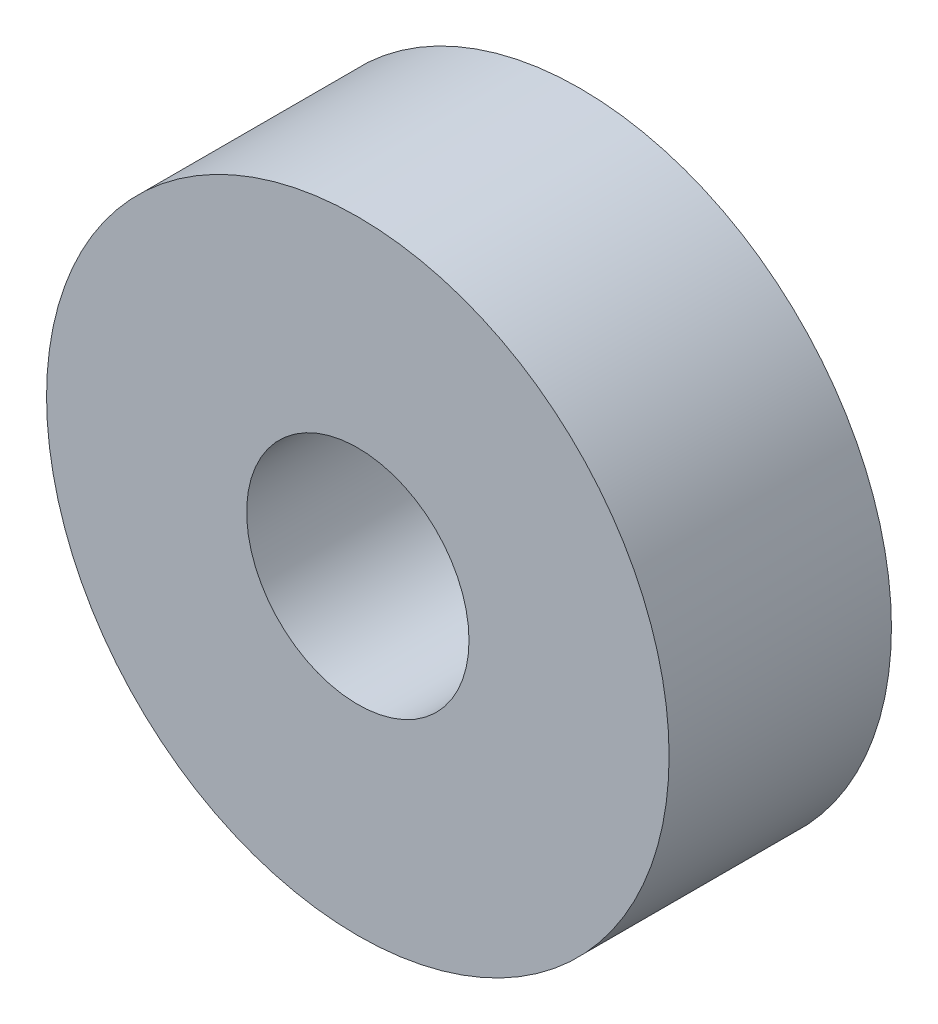
ISO-10303-21;
HEADER;
FILE_DESCRIPTION(('STEP AP214'),'2;1');
FILE_NAME('part.step','',(''),(''),'','','');
FILE_SCHEMA(('AUTOMOTIVE_DESIGN { 1 0 10303 214 1 1 1 1 }'));
ENDSEC;
DATA;
#1=APPLICATION_CONTEXT('core data for automotive mechanical design processes');
#2=APPLICATION_PROTOCOL_DEFINITION('international standard','automotive_design',2000,#1);
#3=PRODUCT_CONTEXT('',#1,'mechanical');
#4=PRODUCT('Part','Part','',(#3));
#5=PRODUCT_RELATED_PRODUCT_CATEGORY('part','',(#4));
#6=PRODUCT_DEFINITION_FORMATION('','',#4);
#7=PRODUCT_DEFINITION_CONTEXT('part definition',#1,'design');
#8=PRODUCT_DEFINITION('design','',#6,#7);
#9=PRODUCT_DEFINITION_SHAPE('','',#8);
#10=(LENGTH_UNIT() NAMED_UNIT(*) SI_UNIT(.MILLI.,.METRE.));
#11=(NAMED_UNIT(*) PLANE_ANGLE_UNIT() SI_UNIT($,.RADIAN.));
#12=(NAMED_UNIT(*) SI_UNIT($,.STERADIAN.) SOLID_ANGLE_UNIT());
#13=UNCERTAINTY_MEASURE_WITH_UNIT(LENGTH_MEASURE(1.E-05),#10,'distance_accuracy_value','');
#14=(GEOMETRIC_REPRESENTATION_CONTEXT(3) GLOBAL_UNCERTAINTY_ASSIGNED_CONTEXT((#13)) GLOBAL_UNIT_ASSIGNED_CONTEXT((#10,
#11,#12)) REPRESENTATION_CONTEXT('',''));
#15=CARTESIAN_POINT('',(0.,0.,0.));
#16=DIRECTION('',(0.,0.,1.));
#17=DIRECTION('',(1.,0.,0.));
#18=AXIS2_PLACEMENT_3D('',#15,#16,#17);
#19=CARTESIAN_POINT('',(0.,0.,5.));
#20=DIRECTION('',(0.,0.,1.));
#21=DIRECTION('',(1.,0.,0.));
#22=AXIS2_PLACEMENT_3D('',#19,#20,#21);
#23=PLANE('',#22);
#24=CARTESIAN_POINT('',(0.,0.,5.));
#25=DIRECTION('',(0.,0.,1.));
#26=DIRECTION('',(1.,0.,0.));
#27=AXIS2_PLACEMENT_3D('',#24,#25,#26);
#28=CIRCLE('',#27,7.);
#29=CARTESIAN_POINT('',(7.,0.,5.));
#30=VERTEX_POINT('',#29);
#31=EDGE_CURVE('E10',#30,#30,#28,.T.);
#32=ORIENTED_EDGE('',*,*,#31,.T.);
#33=EDGE_LOOP('',(#32));
#34=FACE_BOUND('',#33,.T.);
#35=CARTESIAN_POINT('',(0.,0.,5.));
#36=DIRECTION('',(0.,0.,1.));
#37=DIRECTION('',(1.,0.,0.));
#38=AXIS2_PLACEMENT_3D('',#35,#36,#37);
#39=CIRCLE('',#38,2.5);
#40=CARTESIAN_POINT('',(2.5,0.,5.));
#41=VERTEX_POINT('',#40);
#42=EDGE_CURVE('E56',#41,#41,#39,.T.);
#43=ORIENTED_EDGE('',*,*,#42,.F.);
#44=EDGE_LOOP('',(#43));
#45=FACE_BOUND('',#44,.T.);
#46=ADVANCED_FACE('F43',(#34,#45),#23,.T.);
#47=CARTESIAN_POINT('',(0.,0.,0.));
#48=DIRECTION('',(0.,0.,1.));
#49=DIRECTION('',(1.,0.,0.));
#50=AXIS2_PLACEMENT_3D('',#47,#48,#49);
#51=PLANE('',#50);
#52=CARTESIAN_POINT('',(0.,0.,0.));
#53=DIRECTION('',(0.,0.,1.));
#54=DIRECTION('',(1.,0.,0.));
#55=AXIS2_PLACEMENT_3D('',#52,#53,#54);
#56=CIRCLE('',#55,7.);
#57=CARTESIAN_POINT('',(7.,0.,0.));
#58=VERTEX_POINT('',#57);
#59=EDGE_CURVE('E47',#58,#58,#56,.T.);
#60=ORIENTED_EDGE('',*,*,#59,.F.);
#61=EDGE_LOOP('',(#60));
#62=FACE_BOUND('',#61,.T.);
#63=CARTESIAN_POINT('',(0.,0.,0.));
#64=DIRECTION('',(0.,0.,1.));
#65=DIRECTION('',(1.,0.,0.));
#66=AXIS2_PLACEMENT_3D('',#63,#64,#65);
#67=CIRCLE('',#66,2.5);
#68=CARTESIAN_POINT('',(2.5,0.,0.));
#69=VERTEX_POINT('',#68);
#70=EDGE_CURVE('E58',#69,#69,#67,.T.);
#71=ORIENTED_EDGE('',*,*,#70,.T.);
#72=EDGE_LOOP('',(#71));
#73=FACE_BOUND('',#72,.T.);
#74=ADVANCED_FACE('F70',(#62,#73),#51,.F.);
#75=CARTESIAN_POINT('',(0.,0.,5.));
#76=DIRECTION('',(0.,0.,-1.));
#77=DIRECTION('',(-1.,0.,0.));
#78=AXIS2_PLACEMENT_3D('',#75,#76,#77);
#79=CYLINDRICAL_SURFACE('',#78,7.);
#80=ORIENTED_EDGE('',*,*,#31,.F.);
#81=EDGE_LOOP('',(#80));
#82=FACE_BOUND('',#81,.T.);
#83=ORIENTED_EDGE('',*,*,#59,.T.);
#84=EDGE_LOOP('',(#83));
#85=FACE_BOUND('',#84,.T.);
#86=ADVANCED_FACE('F45',(#82,#85),#79,.T.);
#87=CARTESIAN_POINT('',(0.,0.,5.));
#88=DIRECTION('',(0.,0.,-1.));
#89=DIRECTION('',(-1.,0.,0.));
#90=AXIS2_PLACEMENT_3D('',#87,#88,#89);
#91=CYLINDRICAL_SURFACE('',#90,2.5);
#92=ORIENTED_EDGE('',*,*,#42,.T.);
#93=EDGE_LOOP('',(#92));
#94=FACE_BOUND('',#93,.T.);
#95=ORIENTED_EDGE('',*,*,#70,.F.);
#96=EDGE_LOOP('',(#95));
#97=FACE_BOUND('',#96,.T.);
#98=ADVANCED_FACE('F66',(#94,#97),#91,.F.);
#99=CLOSED_SHELL('',(#46,#74,#86,#98));
#100=MANIFOLD_SOLID_BREP('B2',#99);
#101=ADVANCED_BREP_SHAPE_REPRESENTATION('',(#18,#100),#14);
#102=SHAPE_DEFINITION_REPRESENTATION(#9,#101);
ENDSEC;
END-ISO-10303-21;
